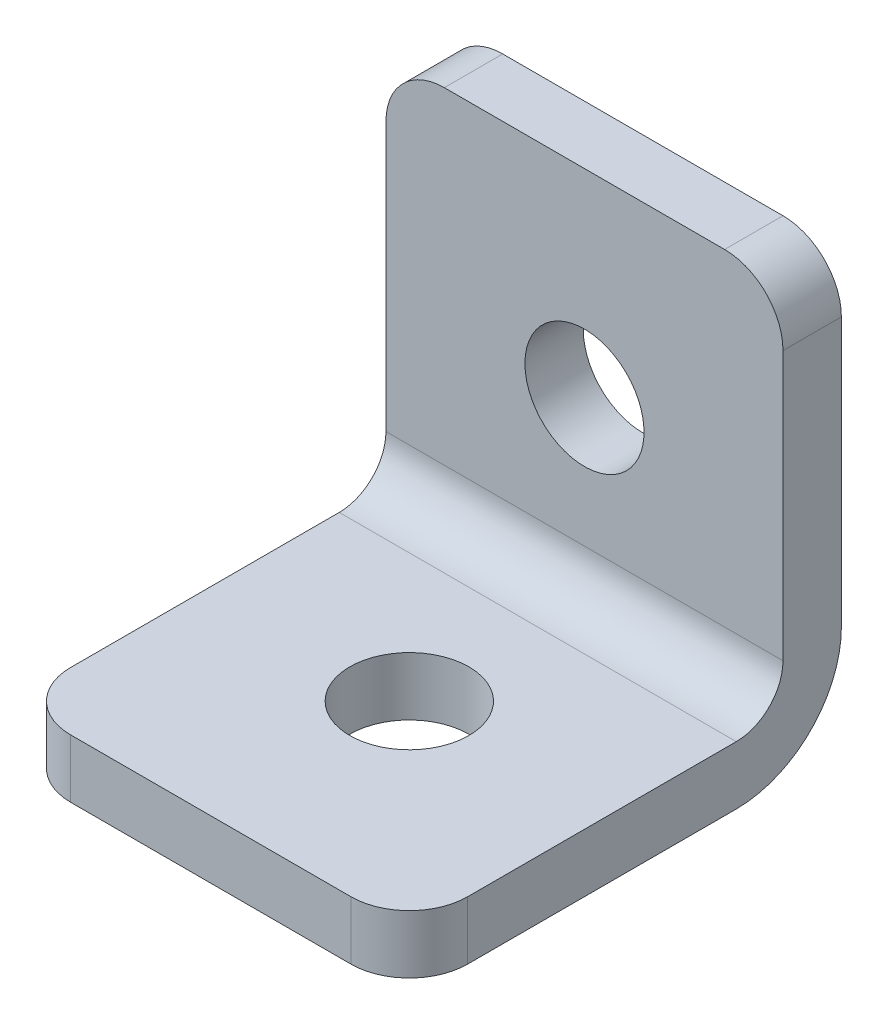
ISO-10303-21;
HEADER;
FILE_DESCRIPTION(('STEP AP214'),'2;1');
FILE_NAME('part.step','',(''),(''),'','','');
FILE_SCHEMA(('AUTOMOTIVE_DESIGN { 1 0 10303 214 1 1 1 1 }'));
ENDSEC;
DATA;
#1=APPLICATION_CONTEXT('core data for automotive mechanical design processes');
#2=APPLICATION_PROTOCOL_DEFINITION('international standard','automotive_design',2000,#1);
#3=PRODUCT_CONTEXT('',#1,'mechanical');
#4=PRODUCT('Part','Part','',(#3));
#5=PRODUCT_RELATED_PRODUCT_CATEGORY('part','',(#4));
#6=PRODUCT_DEFINITION_FORMATION('','',#4);
#7=PRODUCT_DEFINITION_CONTEXT('part definition',#1,'design');
#8=PRODUCT_DEFINITION('design','',#6,#7);
#9=PRODUCT_DEFINITION_SHAPE('','',#8);
#10=(LENGTH_UNIT() NAMED_UNIT(*) SI_UNIT(.MILLI.,.METRE.));
#11=(NAMED_UNIT(*) PLANE_ANGLE_UNIT() SI_UNIT($,.RADIAN.));
#12=(NAMED_UNIT(*) SI_UNIT($,.STERADIAN.) SOLID_ANGLE_UNIT());
#13=UNCERTAINTY_MEASURE_WITH_UNIT(LENGTH_MEASURE(1.E-05),#10,'distance_accuracy_value','');
#14=(GEOMETRIC_REPRESENTATION_CONTEXT(3) GLOBAL_UNCERTAINTY_ASSIGNED_CONTEXT((#13)) GLOBAL_UNIT_ASSIGNED_CONTEXT((#10,
#11,#12)) REPRESENTATION_CONTEXT('',''));
#15=CARTESIAN_POINT('',(0.,0.,0.));
#16=DIRECTION('',(0.,0.,1.));
#17=DIRECTION('',(1.,0.,0.));
#18=AXIS2_PLACEMENT_3D('',#15,#16,#17);
#19=CARTESIAN_POINT('',(17.,0.,0.));
#20=DIRECTION('',(0.,0.,-1.));
#21=DIRECTION('',(-1.,0.,0.));
#22=AXIS2_PLACEMENT_3D('',#19,#20,#21);
#23=PLANE('',#22);
#24=DIRECTION('',(-1.,0.,0.));
#25=VECTOR('',#24,1.);
#26=CARTESIAN_POINT('',(17.,0.,0.));
#27=LINE('',#26,#25);
#28=CARTESIAN_POINT('',(14.5,0.,0.));
#29=VERTEX_POINT('',#28);
#30=CARTESIAN_POINT('',(2.5,0.,0.));
#31=VERTEX_POINT('',#30);
#32=EDGE_CURVE('E145',#29,#31,#27,.T.);
#33=ORIENTED_EDGE('',*,*,#32,.F.);
#34=DIRECTION('',(0.,-1.,0.));
#35=VECTOR('',#34,1.);
#36=CARTESIAN_POINT('',(14.5,0.,0.));
#37=LINE('',#36,#35);
#38=CARTESIAN_POINT('',(14.5,2.5,0.));
#39=VERTEX_POINT('',#38);
#40=EDGE_CURVE('E57',#29,#39,#37,.F.);
#41=ORIENTED_EDGE('',*,*,#40,.T.);
#42=DIRECTION('',(-1.,0.,0.));
#43=VECTOR('',#42,1.);
#44=CARTESIAN_POINT('',(17.,2.5,0.));
#45=LINE('',#44,#43);
#46=CARTESIAN_POINT('',(2.5,2.5,0.));
#47=VERTEX_POINT('',#46);
#48=EDGE_CURVE('E162',#39,#47,#45,.T.);
#49=ORIENTED_EDGE('',*,*,#48,.T.);
#50=DIRECTION('',(0.,-1.,0.));
#51=VECTOR('',#50,1.);
#52=CARTESIAN_POINT('',(2.5,0.,0.));
#53=LINE('',#52,#51);
#54=EDGE_CURVE('E216',#47,#31,#53,.T.);
#55=ORIENTED_EDGE('',*,*,#54,.T.);
#56=EDGE_LOOP('',(#33,#41,#49,#55));
#57=FACE_BOUND('',#56,.T.);
#58=ADVANCED_FACE('F34',(#57),#23,.F.);
#59=CARTESIAN_POINT('',(17.,0.,-14.));
#60=DIRECTION('',(0.,1.,0.));
#61=DIRECTION('',(0.,0.,1.));
#62=AXIS2_PLACEMENT_3D('',#59,#60,#61);
#63=PLANE('',#62);
#64=CARTESIAN_POINT('',(8.5,0.,-8.5));
#65=DIRECTION('',(0.,-1.,0.));
#66=DIRECTION('',(0.,0.,-1.));
#67=AXIS2_PLACEMENT_3D('',#64,#65,#66);
#68=CIRCLE('',#67,2.55);
#69=CARTESIAN_POINT('',(8.5,0.,-11.05));
#70=VERTEX_POINT('',#69);
#71=EDGE_CURVE('E221',#70,#70,#68,.T.);
#72=ORIENTED_EDGE('',*,*,#71,.F.);
#73=EDGE_LOOP('',(#72));
#74=FACE_BOUND('',#73,.T.);
#75=DIRECTION('',(0.,0.,-1.));
#76=VECTOR('',#75,1.);
#77=CARTESIAN_POINT('',(17.,0.,-14.));
#78=LINE('',#77,#76);
#79=CARTESIAN_POINT('',(17.,0.,-2.5));
#80=VERTEX_POINT('',#79);
#81=CARTESIAN_POINT('',(17.,0.,-14.));
#82=VERTEX_POINT('',#81);
#83=EDGE_CURVE('E125',#80,#82,#78,.T.);
#84=ORIENTED_EDGE('',*,*,#83,.F.);
#85=CARTESIAN_POINT('',(14.5,0.,-2.5));
#86=DIRECTION('',(0.,1.,0.));
#87=DIRECTION('',(0.,0.,1.));
#88=AXIS2_PLACEMENT_3D('',#85,#86,#87);
#89=CIRCLE('',#88,2.5);
#90=EDGE_CURVE('E214',#80,#29,#89,.F.);
#91=ORIENTED_EDGE('',*,*,#90,.T.);
#92=ORIENTED_EDGE('',*,*,#32,.T.);
#93=CARTESIAN_POINT('',(2.5,0.,-2.5));
#94=DIRECTION('',(0.,1.,0.));
#95=DIRECTION('',(0.,0.,1.));
#96=AXIS2_PLACEMENT_3D('',#93,#94,#95);
#97=CIRCLE('',#96,2.5);
#98=CARTESIAN_POINT('',(0.,0.,-2.5));
#99=VERTEX_POINT('',#98);
#100=EDGE_CURVE('E212',#31,#99,#97,.F.);
#101=ORIENTED_EDGE('',*,*,#100,.T.);
#102=DIRECTION('',(0.,0.,-1.));
#103=VECTOR('',#102,1.);
#104=CARTESIAN_POINT('',(0.,0.,-14.));
#105=LINE('',#104,#103);
#106=CARTESIAN_POINT('',(0.,0.,-14.));
#107=VERTEX_POINT('',#106);
#108=EDGE_CURVE('E142',#99,#107,#105,.T.);
#109=ORIENTED_EDGE('',*,*,#108,.T.);
#110=DIRECTION('',(-1.,0.,0.));
#111=VECTOR('',#110,1.);
#112=CARTESIAN_POINT('',(17.,0.,-14.));
#113=LINE('',#112,#111);
#114=EDGE_CURVE('E139',#82,#107,#113,.T.);
#115=ORIENTED_EDGE('',*,*,#114,.F.);
#116=EDGE_LOOP('',(#84,#91,#92,#101,#109,#115));
#117=FACE_BOUND('',#116,.T.);
#118=ADVANCED_FACE('F140',(#74,#117),#63,.F.);
#119=CARTESIAN_POINT('',(17.,4.5,-14.));
#120=DIRECTION('',(-1.,0.,0.));
#121=DIRECTION('',(0.,0.,1.));
#122=AXIS2_PLACEMENT_3D('',#119,#120,#121);
#123=CYLINDRICAL_SURFACE('',#122,4.5);
#124=CARTESIAN_POINT('',(0.,4.5,-14.));
#125=DIRECTION('',(1.,0.,0.));
#126=DIRECTION('',(0.,0.,1.));
#127=AXIS2_PLACEMENT_3D('',#124,#125,#126);
#128=CIRCLE('',#127,4.5);
#129=CARTESIAN_POINT('',(0.,4.5,-18.5));
#130=VERTEX_POINT('',#129);
#131=EDGE_CURVE('E164',#107,#130,#128,.T.);
#132=ORIENTED_EDGE('',*,*,#131,.T.);
#133=DIRECTION('',(-1.,0.,0.));
#134=VECTOR('',#133,1.);
#135=CARTESIAN_POINT('',(17.,4.5,-18.5));
#136=LINE('',#135,#134);
#137=CARTESIAN_POINT('',(17.,4.5,-18.5));
#138=VERTEX_POINT('',#137);
#139=EDGE_CURVE('E146',#138,#130,#136,.T.);
#140=ORIENTED_EDGE('',*,*,#139,.F.);
#141=CARTESIAN_POINT('',(17.,4.5,-14.));
#142=DIRECTION('',(1.,0.,0.));
#143=DIRECTION('',(0.,0.,1.));
#144=AXIS2_PLACEMENT_3D('',#141,#142,#143);
#145=CIRCLE('',#144,4.5);
#146=EDGE_CURVE('E130',#82,#138,#145,.T.);
#147=ORIENTED_EDGE('',*,*,#146,.F.);
#148=ORIENTED_EDGE('',*,*,#114,.T.);
#149=EDGE_LOOP('',(#132,#140,#147,#148));
#150=FACE_BOUND('',#149,.T.);
#151=ADVANCED_FACE('F148',(#150),#123,.T.);
#152=CARTESIAN_POINT('',(17.,18.5,-18.5));
#153=DIRECTION('',(0.,0.,1.));
#154=DIRECTION('',(1.,0.,0.));
#155=AXIS2_PLACEMENT_3D('',#152,#153,#154);
#156=PLANE('',#155);
#157=CARTESIAN_POINT('',(8.5,10.,-18.5));
#158=DIRECTION('',(0.,0.,-1.));
#159=DIRECTION('',(-1.,0.,0.));
#160=AXIS2_PLACEMENT_3D('',#157,#158,#159);
#161=CIRCLE('',#160,2.55);
#162=CARTESIAN_POINT('',(5.95,10.,-18.5));
#163=VERTEX_POINT('',#162);
#164=EDGE_CURVE('E228',#163,#163,#161,.T.);
#165=ORIENTED_EDGE('',*,*,#164,.F.);
#166=EDGE_LOOP('',(#165));
#167=FACE_BOUND('',#166,.T.);
#168=DIRECTION('',(0.,1.,0.));
#169=VECTOR('',#168,1.);
#170=CARTESIAN_POINT('',(0.,18.5,-18.5));
#171=LINE('',#170,#169);
#172=CARTESIAN_POINT('',(0.,16.,-18.5));
#173=VERTEX_POINT('',#172);
#174=EDGE_CURVE('E167',#130,#173,#171,.T.);
#175=ORIENTED_EDGE('',*,*,#174,.T.);
#176=CARTESIAN_POINT('',(2.5,16.,-18.5));
#177=DIRECTION('',(0.,0.,1.));
#178=DIRECTION('',(1.,0.,0.));
#179=AXIS2_PLACEMENT_3D('',#176,#177,#178);
#180=CIRCLE('',#179,2.5);
#181=CARTESIAN_POINT('',(2.5,18.5,-18.5));
#182=VERTEX_POINT('',#181);
#183=EDGE_CURVE('E206',#173,#182,#180,.F.);
#184=ORIENTED_EDGE('',*,*,#183,.T.);
#185=DIRECTION('',(-1.,0.,0.));
#186=VECTOR('',#185,1.);
#187=CARTESIAN_POINT('',(17.,18.5,-18.5));
#188=LINE('',#187,#186);
#189=CARTESIAN_POINT('',(14.5,18.5,-18.5));
#190=VERTEX_POINT('',#189);
#191=EDGE_CURVE('E185',#190,#182,#188,.T.);
#192=ORIENTED_EDGE('',*,*,#191,.F.);
#193=CARTESIAN_POINT('',(14.5,16.,-18.5));
#194=DIRECTION('',(0.,0.,1.));
#195=DIRECTION('',(1.,0.,0.));
#196=AXIS2_PLACEMENT_3D('',#193,#194,#195);
#197=CIRCLE('',#196,2.5);
#198=CARTESIAN_POINT('',(17.,16.,-18.5));
#199=VERTEX_POINT('',#198);
#200=EDGE_CURVE('E204',#190,#199,#197,.F.);
#201=ORIENTED_EDGE('',*,*,#200,.T.);
#202=DIRECTION('',(0.,1.,0.));
#203=VECTOR('',#202,1.);
#204=CARTESIAN_POINT('',(17.,18.5,-18.5));
#205=LINE('',#204,#203);
#206=EDGE_CURVE('E151',#138,#199,#205,.T.);
#207=ORIENTED_EDGE('',*,*,#206,.F.);
#208=ORIENTED_EDGE('',*,*,#139,.T.);
#209=EDGE_LOOP('',(#175,#184,#192,#201,#207,#208));
#210=FACE_BOUND('',#209,.T.);
#211=ADVANCED_FACE('F236',(#167,#210),#156,.F.);
#212=CARTESIAN_POINT('',(17.,18.5,-16.));
#213=DIRECTION('',(0.,-1.,0.));
#214=DIRECTION('',(0.,0.,-1.));
#215=AXIS2_PLACEMENT_3D('',#212,#213,#214);
#216=PLANE('',#215);
#217=ORIENTED_EDGE('',*,*,#191,.T.);
#218=DIRECTION('',(0.,0.,1.));
#219=VECTOR('',#218,1.);
#220=CARTESIAN_POINT('',(2.5,18.5,-16.));
#221=LINE('',#220,#219);
#222=CARTESIAN_POINT('',(2.5,18.5,-16.));
#223=VERTEX_POINT('',#222);
#224=EDGE_CURVE('E193',#182,#223,#221,.T.);
#225=ORIENTED_EDGE('',*,*,#224,.T.);
#226=DIRECTION('',(-1.,0.,0.));
#227=VECTOR('',#226,1.);
#228=CARTESIAN_POINT('',(17.,18.5,-16.));
#229=LINE('',#228,#227);
#230=CARTESIAN_POINT('',(14.5,18.5,-16.));
#231=VERTEX_POINT('',#230);
#232=EDGE_CURVE('E182',#231,#223,#229,.T.);
#233=ORIENTED_EDGE('',*,*,#232,.F.);
#234=DIRECTION('',(0.,0.,1.));
#235=VECTOR('',#234,1.);
#236=CARTESIAN_POINT('',(14.5,18.5,-16.));
#237=LINE('',#236,#235);
#238=EDGE_CURVE('E191',#231,#190,#237,.F.);
#239=ORIENTED_EDGE('',*,*,#238,.T.);
#240=EDGE_LOOP('',(#217,#225,#233,#239));
#241=FACE_BOUND('',#240,.T.);
#242=ADVANCED_FACE('F239',(#241),#216,.F.);
#243=CARTESIAN_POINT('',(17.,18.5,-16.));
#244=DIRECTION('',(0.,0.,-1.));
#245=DIRECTION('',(-1.,0.,0.));
#246=AXIS2_PLACEMENT_3D('',#243,#244,#245);
#247=PLANE('',#246);
#248=CARTESIAN_POINT('',(8.5,10.,-16.));
#249=DIRECTION('',(0.,0.,-1.));
#250=DIRECTION('',(-1.,0.,0.));
#251=AXIS2_PLACEMENT_3D('',#248,#249,#250);
#252=CIRCLE('',#251,2.55);
#253=CARTESIAN_POINT('',(5.95,10.,-16.));
#254=VERTEX_POINT('',#253);
#255=EDGE_CURVE('E38',#254,#254,#252,.T.);
#256=ORIENTED_EDGE('',*,*,#255,.T.);
#257=EDGE_LOOP('',(#256));
#258=FACE_BOUND('',#257,.T.);
#259=ORIENTED_EDGE('',*,*,#232,.T.);
#260=CARTESIAN_POINT('',(2.5,16.,-16.));
#261=DIRECTION('',(0.,0.,-1.));
#262=DIRECTION('',(-1.,0.,0.));
#263=AXIS2_PLACEMENT_3D('',#260,#261,#262);
#264=CIRCLE('',#263,2.5);
#265=CARTESIAN_POINT('',(0.,16.,-16.));
#266=VERTEX_POINT('',#265);
#267=EDGE_CURVE('E198',#223,#266,#264,.F.);
#268=ORIENTED_EDGE('',*,*,#267,.T.);
#269=DIRECTION('',(0.,-1.,0.));
#270=VECTOR('',#269,1.);
#271=CARTESIAN_POINT('',(0.,18.5,-16.));
#272=LINE('',#271,#270);
#273=CARTESIAN_POINT('',(0.,4.5,-16.));
#274=VERTEX_POINT('',#273);
#275=EDGE_CURVE('E170',#266,#274,#272,.T.);
#276=ORIENTED_EDGE('',*,*,#275,.T.);
#277=DIRECTION('',(-1.,0.,0.));
#278=VECTOR('',#277,1.);
#279=CARTESIAN_POINT('',(17.,4.5,-16.));
#280=LINE('',#279,#278);
#281=CARTESIAN_POINT('',(17.,4.5,-16.));
#282=VERTEX_POINT('',#281);
#283=EDGE_CURVE('E179',#282,#274,#280,.T.);
#284=ORIENTED_EDGE('',*,*,#283,.F.);
#285=DIRECTION('',(0.,-1.,0.));
#286=VECTOR('',#285,1.);
#287=CARTESIAN_POINT('',(17.,18.5,-16.));
#288=LINE('',#287,#286);
#289=CARTESIAN_POINT('',(17.,16.,-16.));
#290=VERTEX_POINT('',#289);
#291=EDGE_CURVE('E153',#290,#282,#288,.T.);
#292=ORIENTED_EDGE('',*,*,#291,.F.);
#293=CARTESIAN_POINT('',(14.5,16.,-16.));
#294=DIRECTION('',(0.,0.,-1.));
#295=DIRECTION('',(-1.,0.,0.));
#296=AXIS2_PLACEMENT_3D('',#293,#294,#295);
#297=CIRCLE('',#296,2.5);
#298=EDGE_CURVE('E196',#290,#231,#297,.F.);
#299=ORIENTED_EDGE('',*,*,#298,.T.);
#300=EDGE_LOOP('',(#259,#268,#276,#284,#292,#299));
#301=FACE_BOUND('',#300,.T.);
#302=ADVANCED_FACE('F253',(#258,#301),#247,.F.);
#303=CARTESIAN_POINT('',(17.,4.5,-14.));
#304=DIRECTION('',(-1.,0.,0.));
#305=DIRECTION('',(0.,0.,1.));
#306=AXIS2_PLACEMENT_3D('',#303,#304,#305);
#307=CYLINDRICAL_SURFACE('',#306,2.);
#308=CARTESIAN_POINT('',(0.,4.5,-14.));
#309=DIRECTION('',(-1.,0.,0.));
#310=DIRECTION('',(0.,0.,1.));
#311=AXIS2_PLACEMENT_3D('',#308,#309,#310);
#312=CIRCLE('',#311,2.);
#313=CARTESIAN_POINT('',(0.,2.5,-14.));
#314=VERTEX_POINT('',#313);
#315=EDGE_CURVE('E172',#274,#314,#312,.T.);
#316=ORIENTED_EDGE('',*,*,#315,.T.);
#317=DIRECTION('',(-1.,0.,0.));
#318=VECTOR('',#317,1.);
#319=CARTESIAN_POINT('',(17.,2.5,-14.));
#320=LINE('',#319,#318);
#321=CARTESIAN_POINT('',(17.,2.5,-14.));
#322=VERTEX_POINT('',#321);
#323=EDGE_CURVE('E176',#322,#314,#320,.T.);
#324=ORIENTED_EDGE('',*,*,#323,.F.);
#325=CARTESIAN_POINT('',(17.,4.5,-14.));
#326=DIRECTION('',(-1.,0.,0.));
#327=DIRECTION('',(0.,0.,1.));
#328=AXIS2_PLACEMENT_3D('',#325,#326,#327);
#329=CIRCLE('',#328,2.);
#330=EDGE_CURVE('E158',#282,#322,#329,.T.);
#331=ORIENTED_EDGE('',*,*,#330,.F.);
#332=ORIENTED_EDGE('',*,*,#283,.T.);
#333=EDGE_LOOP('',(#316,#324,#331,#332));
#334=FACE_BOUND('',#333,.T.);
#335=ADVANCED_FACE('F265',(#334),#307,.F.);
#336=CARTESIAN_POINT('',(17.,2.5,-14.));
#337=DIRECTION('',(0.,-1.,0.));
#338=DIRECTION('',(0.,0.,-1.));
#339=AXIS2_PLACEMENT_3D('',#336,#337,#338);
#340=PLANE('',#339);
#341=CARTESIAN_POINT('',(8.5,2.5,-8.5));
#342=DIRECTION('',(0.,-1.,0.));
#343=DIRECTION('',(0.,0.,-1.));
#344=AXIS2_PLACEMENT_3D('',#341,#342,#343);
#345=CIRCLE('',#344,2.55);
#346=CARTESIAN_POINT('',(8.5,2.5,-11.05));
#347=VERTEX_POINT('',#346);
#348=EDGE_CURVE('E165',#347,#347,#345,.T.);
#349=ORIENTED_EDGE('',*,*,#348,.T.);
#350=EDGE_LOOP('',(#349));
#351=FACE_BOUND('',#350,.T.);
#352=ORIENTED_EDGE('',*,*,#48,.F.);
#353=CARTESIAN_POINT('',(14.5,2.5,-2.5));
#354=DIRECTION('',(0.,-1.,0.));
#355=DIRECTION('',(0.,0.,-1.));
#356=AXIS2_PLACEMENT_3D('',#353,#354,#355);
#357=CIRCLE('',#356,2.5);
#358=CARTESIAN_POINT('',(17.,2.5,-2.5));
#359=VERTEX_POINT('',#358);
#360=EDGE_CURVE('E11',#39,#359,#357,.F.);
#361=ORIENTED_EDGE('',*,*,#360,.T.);
#362=DIRECTION('',(0.,0.,1.));
#363=VECTOR('',#362,1.);
#364=CARTESIAN_POINT('',(17.,2.5,-14.));
#365=LINE('',#364,#363);
#366=EDGE_CURVE('E160',#322,#359,#365,.T.);
#367=ORIENTED_EDGE('',*,*,#366,.F.);
#368=ORIENTED_EDGE('',*,*,#323,.T.);
#369=DIRECTION('',(0.,0.,1.));
#370=VECTOR('',#369,1.);
#371=CARTESIAN_POINT('',(0.,2.5,-14.));
#372=LINE('',#371,#370);
#373=CARTESIAN_POINT('',(0.,2.5,-2.5));
#374=VERTEX_POINT('',#373);
#375=EDGE_CURVE('E136',#314,#374,#372,.T.);
#376=ORIENTED_EDGE('',*,*,#375,.T.);
#377=CARTESIAN_POINT('',(2.5,2.5,-2.5));
#378=DIRECTION('',(0.,-1.,0.));
#379=DIRECTION('',(0.,0.,-1.));
#380=AXIS2_PLACEMENT_3D('',#377,#378,#379);
#381=CIRCLE('',#380,2.5);
#382=EDGE_CURVE('E43',#374,#47,#381,.F.);
#383=ORIENTED_EDGE('',*,*,#382,.T.);
#384=EDGE_LOOP('',(#352,#361,#367,#368,#376,#383));
#385=FACE_BOUND('',#384,.T.);
#386=ADVANCED_FACE('F268',(#351,#385),#340,.F.);
#387=CARTESIAN_POINT('',(17.,4.5,-14.));
#388=DIRECTION('',(-1.,0.,0.));
#389=DIRECTION('',(0.,0.,1.));
#390=AXIS2_PLACEMENT_3D('',#387,#388,#389);
#391=PLANE('',#390);
#392=ORIENTED_EDGE('',*,*,#206,.T.);
#393=DIRECTION('',(0.,0.,1.));
#394=VECTOR('',#393,1.);
#395=CARTESIAN_POINT('',(17.,16.,-14.));
#396=LINE('',#395,#394);
#397=EDGE_CURVE('E209',#199,#290,#396,.T.);
#398=ORIENTED_EDGE('',*,*,#397,.T.);
#399=ORIENTED_EDGE('',*,*,#291,.T.);
#400=ORIENTED_EDGE('',*,*,#330,.T.);
#401=ORIENTED_EDGE('',*,*,#366,.T.);
#402=DIRECTION('',(0.,-1.,0.));
#403=VECTOR('',#402,1.);
#404=CARTESIAN_POINT('',(17.,4.5,-2.5));
#405=LINE('',#404,#403);
#406=EDGE_CURVE('E134',#359,#80,#405,.T.);
#407=ORIENTED_EDGE('',*,*,#406,.T.);
#408=ORIENTED_EDGE('',*,*,#83,.T.);
#409=ORIENTED_EDGE('',*,*,#146,.T.);
#410=EDGE_LOOP('',(#392,#398,#399,#400,#401,#407,#408,#409));
#411=FACE_BOUND('',#410,.T.);
#412=ADVANCED_FACE('F128',(#411),#391,.F.);
#413=CARTESIAN_POINT('',(0.,4.5,-14.));
#414=DIRECTION('',(-1.,0.,0.));
#415=DIRECTION('',(0.,0.,1.));
#416=AXIS2_PLACEMENT_3D('',#413,#414,#415);
#417=PLANE('',#416);
#418=ORIENTED_EDGE('',*,*,#275,.F.);
#419=DIRECTION('',(0.,0.,1.));
#420=VECTOR('',#419,1.);
#421=CARTESIAN_POINT('',(0.,16.,-18.5));
#422=LINE('',#421,#420);
#423=EDGE_CURVE('E202',#266,#173,#422,.F.);
#424=ORIENTED_EDGE('',*,*,#423,.T.);
#425=ORIENTED_EDGE('',*,*,#174,.F.);
#426=ORIENTED_EDGE('',*,*,#131,.F.);
#427=ORIENTED_EDGE('',*,*,#108,.F.);
#428=DIRECTION('',(0.,-1.,0.));
#429=VECTOR('',#428,1.);
#430=CARTESIAN_POINT('',(0.,2.5,-2.5));
#431=LINE('',#430,#429);
#432=EDGE_CURVE('E200',#99,#374,#431,.F.);
#433=ORIENTED_EDGE('',*,*,#432,.T.);
#434=ORIENTED_EDGE('',*,*,#375,.F.);
#435=ORIENTED_EDGE('',*,*,#315,.F.);
#436=EDGE_LOOP('',(#418,#424,#425,#426,#427,#433,#434,#435));
#437=FACE_BOUND('',#436,.T.);
#438=ADVANCED_FACE('F275',(#437),#417,.T.);
#439=CARTESIAN_POINT('',(2.5,16.,-16.));
#440=DIRECTION('',(0.,0.,-1.));
#441=DIRECTION('',(-1.,0.,0.));
#442=AXIS2_PLACEMENT_3D('',#439,#440,#441);
#443=CYLINDRICAL_SURFACE('',#442,2.5);
#444=ORIENTED_EDGE('',*,*,#183,.F.);
#445=ORIENTED_EDGE('',*,*,#423,.F.);
#446=ORIENTED_EDGE('',*,*,#267,.F.);
#447=ORIENTED_EDGE('',*,*,#224,.F.);
#448=EDGE_LOOP('',(#444,#445,#446,#447));
#449=FACE_BOUND('',#448,.T.);
#450=ADVANCED_FACE('F248',(#449),#443,.T.);
#451=CARTESIAN_POINT('',(14.5,16.,-14.));
#452=DIRECTION('',(0.,0.,1.));
#453=DIRECTION('',(1.,0.,0.));
#454=AXIS2_PLACEMENT_3D('',#451,#452,#453);
#455=CYLINDRICAL_SURFACE('',#454,2.5);
#456=ORIENTED_EDGE('',*,*,#200,.F.);
#457=ORIENTED_EDGE('',*,*,#238,.F.);
#458=ORIENTED_EDGE('',*,*,#298,.F.);
#459=ORIENTED_EDGE('',*,*,#397,.F.);
#460=EDGE_LOOP('',(#456,#457,#458,#459));
#461=FACE_BOUND('',#460,.T.);
#462=ADVANCED_FACE('F260',(#461),#455,.T.);
#463=CARTESIAN_POINT('',(14.5,4.5,-2.5));
#464=DIRECTION('',(0.,-1.,0.));
#465=DIRECTION('',(0.,0.,-1.));
#466=AXIS2_PLACEMENT_3D('',#463,#464,#465);
#467=CYLINDRICAL_SURFACE('',#466,2.5);
#468=ORIENTED_EDGE('',*,*,#360,.F.);
#469=ORIENTED_EDGE('',*,*,#40,.F.);
#470=ORIENTED_EDGE('',*,*,#90,.F.);
#471=ORIENTED_EDGE('',*,*,#406,.F.);
#472=EDGE_LOOP('',(#468,#469,#470,#471));
#473=FACE_BOUND('',#472,.T.);
#474=ADVANCED_FACE('F271',(#473),#467,.T.);
#475=CARTESIAN_POINT('',(2.5,0.,-2.5));
#476=DIRECTION('',(0.,1.,0.));
#477=DIRECTION('',(0.,0.,1.));
#478=AXIS2_PLACEMENT_3D('',#475,#476,#477);
#479=CYLINDRICAL_SURFACE('',#478,2.5);
#480=ORIENTED_EDGE('',*,*,#382,.F.);
#481=ORIENTED_EDGE('',*,*,#432,.F.);
#482=ORIENTED_EDGE('',*,*,#100,.F.);
#483=ORIENTED_EDGE('',*,*,#54,.F.);
#484=EDGE_LOOP('',(#480,#481,#482,#483));
#485=FACE_BOUND('',#484,.T.);
#486=ADVANCED_FACE('F36',(#485),#479,.T.);
#487=CARTESIAN_POINT('',(8.5,17.,-8.5));
#488=DIRECTION('',(0.,-1.,0.));
#489=DIRECTION('',(0.,0.,-1.));
#490=AXIS2_PLACEMENT_3D('',#487,#488,#489);
#491=CYLINDRICAL_SURFACE('',#490,2.55);
#492=ORIENTED_EDGE('',*,*,#71,.T.);
#493=EDGE_LOOP('',(#492));
#494=FACE_BOUND('',#493,.T.);
#495=ORIENTED_EDGE('',*,*,#348,.F.);
#496=EDGE_LOOP('',(#495));
#497=FACE_BOUND('',#496,.T.);
#498=ADVANCED_FACE('F299',(#494,#497),#491,.F.);
#499=CARTESIAN_POINT('',(8.5,10.,-1.5));
#500=DIRECTION('',(0.,0.,-1.));
#501=DIRECTION('',(-1.,0.,0.));
#502=AXIS2_PLACEMENT_3D('',#499,#500,#501);
#503=CYLINDRICAL_SURFACE('',#502,2.55);
#504=ORIENTED_EDGE('',*,*,#164,.T.);
#505=EDGE_LOOP('',(#504));
#506=FACE_BOUND('',#505,.T.);
#507=ORIENTED_EDGE('',*,*,#255,.F.);
#508=EDGE_LOOP('',(#507));
#509=FACE_BOUND('',#508,.T.);
#510=ADVANCED_FACE('F233',(#506,#509),#503,.F.);
#511=CLOSED_SHELL('',(#58,#118,#151,#211,#242,#302,#335,#386,#412,#438,#450,#462,#474,#486,#498,#510));
#512=MANIFOLD_SOLID_BREP('B2',#511);
#513=ADVANCED_BREP_SHAPE_REPRESENTATION('',(#18,#512),#14);
#514=SHAPE_DEFINITION_REPRESENTATION(#9,#513);
ENDSEC;
END-ISO-10303-21;
